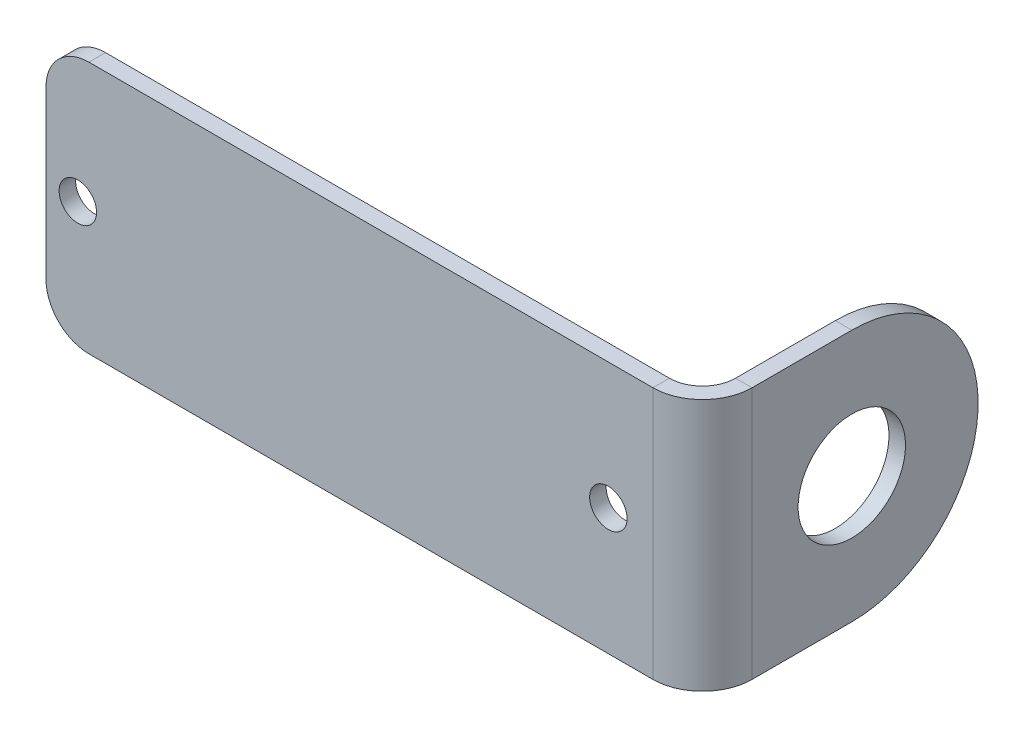
ISO-10303-21;
HEADER;
FILE_DESCRIPTION(('STEP AP214'),'2;1');
FILE_NAME('part.step','',(''),(''),'','','');
FILE_SCHEMA(('AUTOMOTIVE_DESIGN { 1 0 10303 214 1 1 1 1 }'));
ENDSEC;
DATA;
#1=APPLICATION_CONTEXT('core data for automotive mechanical design processes');
#2=APPLICATION_PROTOCOL_DEFINITION('international standard','automotive_design',2000,#1);
#3=PRODUCT_CONTEXT('',#1,'mechanical');
#4=PRODUCT('Part','Part','',(#3));
#5=PRODUCT_RELATED_PRODUCT_CATEGORY('part','',(#4));
#6=PRODUCT_DEFINITION_FORMATION('','',#4);
#7=PRODUCT_DEFINITION_CONTEXT('part definition',#1,'design');
#8=PRODUCT_DEFINITION('design','',#6,#7);
#9=PRODUCT_DEFINITION_SHAPE('','',#8);
#10=(LENGTH_UNIT() NAMED_UNIT(*) SI_UNIT(.MILLI.,.METRE.));
#11=(NAMED_UNIT(*) PLANE_ANGLE_UNIT() SI_UNIT($,.RADIAN.));
#12=(NAMED_UNIT(*) SI_UNIT($,.STERADIAN.) SOLID_ANGLE_UNIT());
#13=UNCERTAINTY_MEASURE_WITH_UNIT(LENGTH_MEASURE(1.E-05),#10,'distance_accuracy_value','');
#14=(GEOMETRIC_REPRESENTATION_CONTEXT(3) GLOBAL_UNCERTAINTY_ASSIGNED_CONTEXT((#13)) GLOBAL_UNIT_ASSIGNED_CONTEXT((#10,
#11,#12)) REPRESENTATION_CONTEXT('',''));
#15=CARTESIAN_POINT('',(0.,0.,0.));
#16=DIRECTION('',(0.,0.,1.));
#17=DIRECTION('',(1.,0.,0.));
#18=AXIS2_PLACEMENT_3D('',#15,#16,#17);
#19=CARTESIAN_POINT('',(31.1197568872597,0.,31.0102431127404));
#20=DIRECTION('',(1.,0.,0.));
#21=DIRECTION('',(0.,0.,-1.));
#22=AXIS2_PLACEMENT_3D('',#19,#20,#21);
#23=PLANE('',#22);
#24=CARTESIAN_POINT('',(31.1197568872595,0.,-12.0547568872596));
#25=DIRECTION('',(1.,0.,0.));
#26=DIRECTION('',(0.,0.,-1.));
#27=AXIS2_PLACEMENT_3D('',#24,#25,#26);
#28=CIRCLE('',#27,4.875);
#29=CARTESIAN_POINT('',(31.1197568872595,0.,-16.9297568872596));
#30=VERTEX_POINT('',#29);
#31=EDGE_CURVE('E191',#30,#30,#28,.T.);
#32=ORIENTED_EDGE('',*,*,#31,.T.);
#33=EDGE_LOOP('',(#32));
#34=FACE_BOUND('',#33,.T.);
#35=DIRECTION('',(0.,0.,-1.));
#36=VECTOR('',#35,1.);
#37=CARTESIAN_POINT('',(31.1197568872597,-11.465,31.0102431127404));
#38=LINE('',#37,#36);
#39=CARTESIAN_POINT('',(31.1197568872595,-11.465,-3.00000000000002));
#40=VERTEX_POINT('',#39);
#41=CARTESIAN_POINT('',(31.1197568872595,-11.465,-12.0547568872596));
#42=VERTEX_POINT('',#41);
#43=EDGE_CURVE('E61',#40,#42,#38,.T.);
#44=ORIENTED_EDGE('',*,*,#43,.F.);
#45=DIRECTION('',(0.,1.,0.));
#46=VECTOR('',#45,1.);
#47=CARTESIAN_POINT('',(31.1197568872595,0.,-3.00000000000002));
#48=LINE('',#47,#46);
#49=CARTESIAN_POINT('',(31.1197568872595,11.465,-3.00000000000002));
#50=VERTEX_POINT('',#49);
#51=EDGE_CURVE('E53',#40,#50,#48,.T.);
#52=ORIENTED_EDGE('',*,*,#51,.T.);
#53=DIRECTION('',(0.,0.,-1.));
#54=VECTOR('',#53,1.);
#55=CARTESIAN_POINT('',(31.1197568872597,11.465,31.0102431127404));
#56=LINE('',#55,#54);
#57=CARTESIAN_POINT('',(31.1197568872595,11.465,-12.0547568872596));
#58=VERTEX_POINT('',#57);
#59=EDGE_CURVE('E69',#58,#50,#56,.F.);
#60=ORIENTED_EDGE('',*,*,#59,.F.);
#61=CARTESIAN_POINT('',(31.1197568872595,0.,-12.0547568872596));
#62=DIRECTION('',(1.,0.,0.));
#63=DIRECTION('',(0.,0.,1.));
#64=AXIS2_PLACEMENT_3D('',#61,#62,#63);
#65=CIRCLE('',#64,11.465);
#66=EDGE_CURVE('E199',#42,#58,#65,.T.);
#67=ORIENTED_EDGE('',*,*,#66,.F.);
#68=EDGE_LOOP('',(#44,#52,#60,#67));
#69=FACE_BOUND('',#68,.T.);
#70=ADVANCED_FACE('F44',(#34,#69),#23,.F.);
#71=CARTESIAN_POINT('',(32.6197568872598,-11.465,57.9752431127404));
#72=DIRECTION('',(0.,-1.,0.));
#73=DIRECTION('',(0.,0.,-1.));
#74=AXIS2_PLACEMENT_3D('',#71,#72,#73);
#75=PLANE('',#74);
#76=DIRECTION('',(1.,0.,0.));
#77=VECTOR('',#76,1.);
#78=CARTESIAN_POINT('',(32.6197568872595,-11.465,-3.00000000000002));
#79=LINE('',#78,#77);
#80=CARTESIAN_POINT('',(32.6197568872595,-11.465,-3.00000000000002));
#81=VERTEX_POINT('',#80);
#82=EDGE_CURVE('E12',#40,#81,#79,.T.);
#83=ORIENTED_EDGE('',*,*,#82,.F.);
#84=ORIENTED_EDGE('',*,*,#43,.T.);
#85=DIRECTION('',(1.,0.,0.));
#86=VECTOR('',#85,1.);
#87=CARTESIAN_POINT('',(31.1197568872595,-11.465,-12.0547568872596));
#88=LINE('',#87,#86);
#89=CARTESIAN_POINT('',(32.6197568872595,-11.465,-12.0547568872596));
#90=VERTEX_POINT('',#89);
#91=EDGE_CURVE('E202',#42,#90,#88,.T.);
#92=ORIENTED_EDGE('',*,*,#91,.T.);
#93=DIRECTION('',(0.,0.,-1.));
#94=VECTOR('',#93,1.);
#95=CARTESIAN_POINT('',(32.6197568872598,-11.465,57.9752431127404));
#96=LINE('',#95,#94);
#97=EDGE_CURVE('E48',#81,#90,#96,.T.);
#98=ORIENTED_EDGE('',*,*,#97,.F.);
#99=EDGE_LOOP('',(#83,#84,#92,#98));
#100=FACE_BOUND('',#99,.T.);
#101=ADVANCED_FACE('F46',(#100),#75,.T.);
#102=CARTESIAN_POINT('',(32.6197568872596,11.465,4.04524311274041));
#103=DIRECTION('',(0.,1.,0.));
#104=DIRECTION('',(0.,0.,1.));
#105=AXIS2_PLACEMENT_3D('',#102,#103,#104);
#106=PLANE('',#105);
#107=DIRECTION('',(-1.,0.,0.));
#108=VECTOR('',#107,1.);
#109=CARTESIAN_POINT('',(32.6197568872595,11.465,-3.00000000000002));
#110=LINE('',#109,#108);
#111=CARTESIAN_POINT('',(32.6197568872595,11.465,-3.00000000000002));
#112=VERTEX_POINT('',#111);
#113=EDGE_CURVE('E211',#112,#50,#110,.T.);
#114=ORIENTED_EDGE('',*,*,#113,.F.);
#115=DIRECTION('',(0.,0.,1.));
#116=VECTOR('',#115,1.);
#117=CARTESIAN_POINT('',(32.6197568872596,11.465,4.04524311274041));
#118=LINE('',#117,#116);
#119=CARTESIAN_POINT('',(32.6197568872595,11.465,-12.0547568872596));
#120=VERTEX_POINT('',#119);
#121=EDGE_CURVE('E215',#120,#112,#118,.T.);
#122=ORIENTED_EDGE('',*,*,#121,.F.);
#123=DIRECTION('',(1.,0.,0.));
#124=VECTOR('',#123,1.);
#125=CARTESIAN_POINT('',(31.1197568872595,11.465,-12.0547568872596));
#126=LINE('',#125,#124);
#127=EDGE_CURVE('E205',#58,#120,#126,.T.);
#128=ORIENTED_EDGE('',*,*,#127,.F.);
#129=ORIENTED_EDGE('',*,*,#59,.T.);
#130=EDGE_LOOP('',(#114,#122,#128,#129));
#131=FACE_BOUND('',#130,.T.);
#132=ADVANCED_FACE('F226',(#131),#106,.T.);
#133=CARTESIAN_POINT('',(32.6197568872597,0.,31.0102431127404));
#134=DIRECTION('',(1.,0.,0.));
#135=DIRECTION('',(0.,0.,-1.));
#136=AXIS2_PLACEMENT_3D('',#133,#134,#135);
#137=PLANE('',#136);
#138=DIRECTION('',(0.,1.,0.));
#139=VECTOR('',#138,1.);
#140=CARTESIAN_POINT('',(32.6197568872595,0.,-3.00000000000002));
#141=LINE('',#140,#139);
#142=EDGE_CURVE('E143',#81,#112,#141,.T.);
#143=ORIENTED_EDGE('',*,*,#142,.F.);
#144=ORIENTED_EDGE('',*,*,#97,.T.);
#145=CARTESIAN_POINT('',(32.6197568872595,0.,-12.0547568872596));
#146=DIRECTION('',(1.,0.,0.));
#147=DIRECTION('',(0.,0.,1.));
#148=AXIS2_PLACEMENT_3D('',#145,#146,#147);
#149=CIRCLE('',#148,11.465);
#150=EDGE_CURVE('E194',#90,#120,#149,.T.);
#151=ORIENTED_EDGE('',*,*,#150,.T.);
#152=ORIENTED_EDGE('',*,*,#121,.T.);
#153=EDGE_LOOP('',(#143,#144,#151,#152));
#154=FACE_BOUND('',#153,.T.);
#155=CARTESIAN_POINT('',(32.6197568872595,0.,-12.0547568872596));
#156=DIRECTION('',(1.,0.,0.));
#157=DIRECTION('',(0.,0.,-1.));
#158=AXIS2_PLACEMENT_3D('',#155,#156,#157);
#159=CIRCLE('',#158,4.875);
#160=CARTESIAN_POINT('',(32.6197568872595,0.,-16.9297568872596));
#161=VERTEX_POINT('',#160);
#162=EDGE_CURVE('E195',#161,#161,#159,.T.);
#163=ORIENTED_EDGE('',*,*,#162,.F.);
#164=EDGE_LOOP('',(#163));
#165=FACE_BOUND('',#164,.T.);
#166=ADVANCED_FACE('F219',(#154,#165),#137,.T.);
#167=CARTESIAN_POINT('',(31.1197568872595,0.,-12.0547568872596));
#168=DIRECTION('',(1.,0.,0.));
#169=DIRECTION('',(0.,0.,-1.));
#170=AXIS2_PLACEMENT_3D('',#167,#168,#169);
#171=CYLINDRICAL_SURFACE('',#170,11.465);
#172=ORIENTED_EDGE('',*,*,#150,.F.);
#173=ORIENTED_EDGE('',*,*,#91,.F.);
#174=ORIENTED_EDGE('',*,*,#66,.T.);
#175=ORIENTED_EDGE('',*,*,#127,.T.);
#176=EDGE_LOOP('',(#172,#173,#174,#175));
#177=FACE_BOUND('',#176,.T.);
#178=ADVANCED_FACE('F225',(#177),#171,.T.);
#179=CARTESIAN_POINT('',(31.1197568872595,0.,-12.0547568872596));
#180=DIRECTION('',(1.,0.,0.));
#181=DIRECTION('',(0.,0.,-1.));
#182=AXIS2_PLACEMENT_3D('',#179,#180,#181);
#183=CYLINDRICAL_SURFACE('',#182,4.875);
#184=ORIENTED_EDGE('',*,*,#31,.F.);
#185=EDGE_LOOP('',(#184));
#186=FACE_BOUND('',#185,.T.);
#187=ORIENTED_EDGE('',*,*,#162,.T.);
#188=EDGE_LOOP('',(#187));
#189=FACE_BOUND('',#188,.T.);
#190=ADVANCED_FACE('F277',(#186,#189),#183,.F.);
#191=CARTESIAN_POINT('',(-23.065,-7.56500000000002,1.49999999999999));
#192=DIRECTION('',(0.,0.,1.));
#193=DIRECTION('',(1.,0.,0.));
#194=AXIS2_PLACEMENT_3D('',#191,#192,#193);
#195=CYLINDRICAL_SURFACE('',#194,3.9);
#196=DIRECTION('',(0.,0.,1.));
#197=VECTOR('',#196,1.);
#198=CARTESIAN_POINT('',(-26.965,-7.56500000000002,1.49999999999999));
#199=LINE('',#198,#197);
#200=CARTESIAN_POINT('',(-26.965,-7.56500000000002,0.));
#201=VERTEX_POINT('',#200);
#202=CARTESIAN_POINT('',(-26.965,-7.56500000000002,1.49999999999999));
#203=VERTEX_POINT('',#202);
#204=EDGE_CURVE('E180',#201,#203,#199,.T.);
#205=ORIENTED_EDGE('',*,*,#204,.F.);
#206=CARTESIAN_POINT('',(-23.065,-7.56500000000002,0.));
#207=DIRECTION('',(0.,0.,1.));
#208=DIRECTION('',(1.,0.,0.));
#209=AXIS2_PLACEMENT_3D('',#206,#207,#208);
#210=CIRCLE('',#209,3.9);
#211=CARTESIAN_POINT('',(-23.065,-11.465,0.));
#212=VERTEX_POINT('',#211);
#213=EDGE_CURVE('E187',#201,#212,#210,.T.);
#214=ORIENTED_EDGE('',*,*,#213,.T.);
#215=DIRECTION('',(0.,0.,1.));
#216=VECTOR('',#215,1.);
#217=CARTESIAN_POINT('',(-23.065,-11.465,1.49999999999999));
#218=LINE('',#217,#216);
#219=CARTESIAN_POINT('',(-23.065,-11.465,1.49999999999999));
#220=VERTEX_POINT('',#219);
#221=EDGE_CURVE('E185',#212,#220,#218,.T.);
#222=ORIENTED_EDGE('',*,*,#221,.T.);
#223=CARTESIAN_POINT('',(-23.065,-7.56500000000002,1.49999999999999));
#224=DIRECTION('',(0.,0.,1.));
#225=DIRECTION('',(1.,0.,0.));
#226=AXIS2_PLACEMENT_3D('',#223,#224,#225);
#227=CIRCLE('',#226,3.9);
#228=EDGE_CURVE('E134',#203,#220,#227,.T.);
#229=ORIENTED_EDGE('',*,*,#228,.F.);
#230=EDGE_LOOP('',(#205,#214,#222,#229));
#231=FACE_BOUND('',#230,.T.);
#232=ADVANCED_FACE('F256',(#231),#195,.T.);
#233=CARTESIAN_POINT('',(-26.965,11.465,1.49999999999999));
#234=DIRECTION('',(-1.,0.,0.));
#235=DIRECTION('',(0.,-1.,0.));
#236=AXIS2_PLACEMENT_3D('',#233,#234,#235);
#237=PLANE('',#236);
#238=DIRECTION('',(0.,0.,1.));
#239=VECTOR('',#238,1.);
#240=CARTESIAN_POINT('',(-26.965,7.56500000000002,1.49999999999999));
#241=LINE('',#240,#239);
#242=CARTESIAN_POINT('',(-26.965,7.56500000000002,0.));
#243=VERTEX_POINT('',#242);
#244=CARTESIAN_POINT('',(-26.965,7.56500000000002,1.49999999999999));
#245=VERTEX_POINT('',#244);
#246=EDGE_CURVE('E175',#243,#245,#241,.T.);
#247=ORIENTED_EDGE('',*,*,#246,.F.);
#248=DIRECTION('',(0.,1.,0.));
#249=VECTOR('',#248,1.);
#250=CARTESIAN_POINT('',(-26.965,0.,0.));
#251=LINE('',#250,#249);
#252=EDGE_CURVE('E182',#243,#201,#251,.F.);
#253=ORIENTED_EDGE('',*,*,#252,.T.);
#254=ORIENTED_EDGE('',*,*,#204,.T.);
#255=DIRECTION('',(0.,-1.,0.));
#256=VECTOR('',#255,1.);
#257=CARTESIAN_POINT('',(-26.965,11.465,1.49999999999999));
#258=LINE('',#257,#256);
#259=EDGE_CURVE('E164',#245,#203,#258,.T.);
#260=ORIENTED_EDGE('',*,*,#259,.F.);
#261=EDGE_LOOP('',(#247,#253,#254,#260));
#262=FACE_BOUND('',#261,.T.);
#263=ADVANCED_FACE('F268',(#262),#237,.T.);
#264=CARTESIAN_POINT('',(-23.065,7.56500000000002,1.49999999999999));
#265=DIRECTION('',(0.,0.,1.));
#266=DIRECTION('',(1.,0.,0.));
#267=AXIS2_PLACEMENT_3D('',#264,#265,#266);
#268=CYLINDRICAL_SURFACE('',#267,3.9);
#269=CARTESIAN_POINT('',(-23.065,7.56500000000002,0.));
#270=DIRECTION('',(0.,0.,1.));
#271=DIRECTION('',(1.,0.,0.));
#272=AXIS2_PLACEMENT_3D('',#269,#270,#271);
#273=CIRCLE('',#272,3.9);
#274=CARTESIAN_POINT('',(-23.065,11.465,0.));
#275=VERTEX_POINT('',#274);
#276=EDGE_CURVE('E177',#275,#243,#273,.T.);
#277=ORIENTED_EDGE('',*,*,#276,.T.);
#278=ORIENTED_EDGE('',*,*,#246,.T.);
#279=CARTESIAN_POINT('',(-23.065,7.56500000000002,1.49999999999999));
#280=DIRECTION('',(0.,0.,1.));
#281=DIRECTION('',(1.,0.,0.));
#282=AXIS2_PLACEMENT_3D('',#279,#280,#281);
#283=CIRCLE('',#282,3.9);
#284=CARTESIAN_POINT('',(-23.065,11.465,1.49999999999999));
#285=VERTEX_POINT('',#284);
#286=EDGE_CURVE('E162',#285,#245,#283,.T.);
#287=ORIENTED_EDGE('',*,*,#286,.F.);
#288=DIRECTION('',(0.,0.,1.));
#289=VECTOR('',#288,1.);
#290=CARTESIAN_POINT('',(-23.065,11.465,1.49999999999999));
#291=LINE('',#290,#289);
#292=EDGE_CURVE('E160',#275,#285,#291,.T.);
#293=ORIENTED_EDGE('',*,*,#292,.F.);
#294=EDGE_LOOP('',(#277,#278,#287,#293));
#295=FACE_BOUND('',#294,.T.);
#296=ADVANCED_FACE('F267',(#295),#268,.T.);
#297=CARTESIAN_POINT('',(-24.0755,0.,1.49999999999999));
#298=DIRECTION('',(0.,0.,1.));
#299=DIRECTION('',(1.,0.,0.));
#300=AXIS2_PLACEMENT_3D('',#297,#298,#299);
#301=CYLINDRICAL_SURFACE('',#300,1.7);
#302=CARTESIAN_POINT('',(-24.0755,0.,1.49999999999999));
#303=DIRECTION('',(0.,0.,1.));
#304=DIRECTION('',(1.,0.,0.));
#305=AXIS2_PLACEMENT_3D('',#302,#303,#304);
#306=CIRCLE('',#305,1.7);
#307=CARTESIAN_POINT('',(-22.3755,0.,1.49999999999999));
#308=VERTEX_POINT('',#307);
#309=EDGE_CURVE('E172',#308,#308,#306,.T.);
#310=ORIENTED_EDGE('',*,*,#309,.T.);
#311=EDGE_LOOP('',(#310));
#312=FACE_BOUND('',#311,.T.);
#313=CARTESIAN_POINT('',(-24.0755,0.,0.));
#314=DIRECTION('',(0.,0.,1.));
#315=DIRECTION('',(1.,0.,0.));
#316=AXIS2_PLACEMENT_3D('',#313,#314,#315);
#317=CIRCLE('',#316,1.7);
#318=CARTESIAN_POINT('',(-22.3755,0.,0.));
#319=VERTEX_POINT('',#318);
#320=EDGE_CURVE('E246',#319,#319,#317,.T.);
#321=ORIENTED_EDGE('',*,*,#320,.F.);
#322=EDGE_LOOP('',(#321));
#323=FACE_BOUND('',#322,.T.);
#324=ADVANCED_FACE('F275',(#312,#323),#301,.F.);
#325=CARTESIAN_POINT('',(24.0755,0.,1.49999999999999));
#326=DIRECTION('',(0.,0.,1.));
#327=DIRECTION('',(1.,0.,0.));
#328=AXIS2_PLACEMENT_3D('',#325,#326,#327);
#329=CYLINDRICAL_SURFACE('',#328,1.7);
#330=CARTESIAN_POINT('',(24.0755,0.,1.49999999999999));
#331=DIRECTION('',(0.,0.,1.));
#332=DIRECTION('',(1.,0.,0.));
#333=AXIS2_PLACEMENT_3D('',#330,#331,#332);
#334=CIRCLE('',#333,1.7);
#335=CARTESIAN_POINT('',(25.7755,0.,1.49999999999999));
#336=VERTEX_POINT('',#335);
#337=EDGE_CURVE('E169',#336,#336,#334,.T.);
#338=ORIENTED_EDGE('',*,*,#337,.T.);
#339=EDGE_LOOP('',(#338));
#340=FACE_BOUND('',#339,.T.);
#341=CARTESIAN_POINT('',(24.0755,0.,0.));
#342=DIRECTION('',(0.,0.,1.));
#343=DIRECTION('',(1.,0.,0.));
#344=AXIS2_PLACEMENT_3D('',#341,#342,#343);
#345=CIRCLE('',#344,1.7);
#346=CARTESIAN_POINT('',(25.7755,0.,0.));
#347=VERTEX_POINT('',#346);
#348=EDGE_CURVE('E243',#347,#347,#345,.T.);
#349=ORIENTED_EDGE('',*,*,#348,.F.);
#350=EDGE_LOOP('',(#349));
#351=FACE_BOUND('',#350,.T.);
#352=ADVANCED_FACE('F303',(#340,#351),#329,.F.);
#353=CARTESIAN_POINT('',(0.,0.,1.49999999999999));
#354=DIRECTION('',(0.,0.,1.));
#355=DIRECTION('',(1.,0.,0.));
#356=AXIS2_PLACEMENT_3D('',#353,#354,#355);
#357=PLANE('',#356);
#358=ORIENTED_EDGE('',*,*,#337,.F.);
#359=EDGE_LOOP('',(#358));
#360=FACE_BOUND('',#359,.T.);
#361=ORIENTED_EDGE('',*,*,#309,.F.);
#362=EDGE_LOOP('',(#361));
#363=FACE_BOUND('',#362,.T.);
#364=DIRECTION('',(1.,0.,0.));
#365=VECTOR('',#364,1.);
#366=CARTESIAN_POINT('',(-26.965,-11.465,1.49999999999999));
#367=LINE('',#366,#365);
#368=CARTESIAN_POINT('',(28.1197568872595,-11.465,1.49999999999999));
#369=VERTEX_POINT('',#368);
#370=EDGE_CURVE('E155',#220,#369,#367,.T.);
#371=ORIENTED_EDGE('',*,*,#370,.T.);
#372=DIRECTION('',(0.,1.,0.));
#373=VECTOR('',#372,1.);
#374=CARTESIAN_POINT('',(28.1197568872595,0.,1.49999999999999));
#375=LINE('',#374,#373);
#376=CARTESIAN_POINT('',(28.1197568872595,11.465,1.49999999999999));
#377=VERTEX_POINT('',#376);
#378=EDGE_CURVE('E141',#369,#377,#375,.T.);
#379=ORIENTED_EDGE('',*,*,#378,.T.);
#380=DIRECTION('',(-1.,0.,0.));
#381=VECTOR('',#380,1.);
#382=CARTESIAN_POINT('',(26.965,11.465,1.49999999999999));
#383=LINE('',#382,#381);
#384=EDGE_CURVE('E151',#377,#285,#383,.T.);
#385=ORIENTED_EDGE('',*,*,#384,.T.);
#386=ORIENTED_EDGE('',*,*,#286,.T.);
#387=ORIENTED_EDGE('',*,*,#259,.T.);
#388=ORIENTED_EDGE('',*,*,#228,.T.);
#389=EDGE_LOOP('',(#371,#379,#385,#386,#387,#388));
#390=FACE_BOUND('',#389,.T.);
#391=ADVANCED_FACE('F149',(#360,#363,#390),#357,.T.);
#392=CARTESIAN_POINT('',(26.965,11.465,1.49999999999999));
#393=DIRECTION('',(0.,1.,0.));
#394=DIRECTION('',(-1.,0.,0.));
#395=AXIS2_PLACEMENT_3D('',#392,#393,#394);
#396=PLANE('',#395);
#397=ORIENTED_EDGE('',*,*,#384,.F.);
#398=DIRECTION('',(0.,0.,-1.));
#399=VECTOR('',#398,1.);
#400=CARTESIAN_POINT('',(28.1197568872595,11.465,1.49999999999999));
#401=LINE('',#400,#399);
#402=CARTESIAN_POINT('',(28.1197568872595,11.465,0.));
#403=VERTEX_POINT('',#402);
#404=EDGE_CURVE('E123',#377,#403,#401,.T.);
#405=ORIENTED_EDGE('',*,*,#404,.T.);
#406=DIRECTION('',(1.,0.,0.));
#407=VECTOR('',#406,1.);
#408=CARTESIAN_POINT('',(0.,11.465,0.));
#409=LINE('',#408,#407);
#410=EDGE_CURVE('E133',#403,#275,#409,.F.);
#411=ORIENTED_EDGE('',*,*,#410,.T.);
#412=ORIENTED_EDGE('',*,*,#292,.T.);
#413=EDGE_LOOP('',(#397,#405,#411,#412));
#414=FACE_BOUND('',#413,.T.);
#415=ADVANCED_FACE('F158',(#414),#396,.T.);
#416=CARTESIAN_POINT('',(0.,0.,0.));
#417=DIRECTION('',(0.,0.,1.));
#418=DIRECTION('',(1.,0.,0.));
#419=AXIS2_PLACEMENT_3D('',#416,#417,#418);
#420=PLANE('',#419);
#421=DIRECTION('',(0.,1.,0.));
#422=VECTOR('',#421,1.);
#423=CARTESIAN_POINT('',(28.1197568872595,0.,0.));
#424=LINE('',#423,#422);
#425=CARTESIAN_POINT('',(28.1197568872595,-11.465,0.));
#426=VERTEX_POINT('',#425);
#427=EDGE_CURVE('E144',#426,#403,#424,.T.);
#428=ORIENTED_EDGE('',*,*,#427,.F.);
#429=DIRECTION('',(1.,0.,0.));
#430=VECTOR('',#429,1.);
#431=CARTESIAN_POINT('',(0.,-11.465,0.));
#432=LINE('',#431,#430);
#433=EDGE_CURVE('E240',#212,#426,#432,.T.);
#434=ORIENTED_EDGE('',*,*,#433,.F.);
#435=ORIENTED_EDGE('',*,*,#213,.F.);
#436=ORIENTED_EDGE('',*,*,#252,.F.);
#437=ORIENTED_EDGE('',*,*,#276,.F.);
#438=ORIENTED_EDGE('',*,*,#410,.F.);
#439=EDGE_LOOP('',(#428,#434,#435,#436,#437,#438));
#440=FACE_BOUND('',#439,.T.);
#441=ORIENTED_EDGE('',*,*,#320,.T.);
#442=EDGE_LOOP('',(#441));
#443=FACE_BOUND('',#442,.T.);
#444=ORIENTED_EDGE('',*,*,#348,.T.);
#445=EDGE_LOOP('',(#444));
#446=FACE_BOUND('',#445,.T.);
#447=ADVANCED_FACE('F262',(#440,#443,#446),#420,.F.);
#448=CARTESIAN_POINT('',(-26.965,-11.465,1.49999999999999));
#449=DIRECTION('',(0.,-1.,0.));
#450=DIRECTION('',(1.,0.,0.));
#451=AXIS2_PLACEMENT_3D('',#448,#449,#450);
#452=PLANE('',#451);
#453=ORIENTED_EDGE('',*,*,#433,.T.);
#454=DIRECTION('',(0.,0.,1.));
#455=VECTOR('',#454,1.);
#456=CARTESIAN_POINT('',(28.1197568872595,-11.465,1.49999999999999));
#457=LINE('',#456,#455);
#458=EDGE_CURVE('E198',#426,#369,#457,.T.);
#459=ORIENTED_EDGE('',*,*,#458,.T.);
#460=ORIENTED_EDGE('',*,*,#370,.F.);
#461=ORIENTED_EDGE('',*,*,#221,.F.);
#462=EDGE_LOOP('',(#453,#459,#460,#461));
#463=FACE_BOUND('',#462,.T.);
#464=ADVANCED_FACE('F260',(#463),#452,.T.);
#465=CARTESIAN_POINT('',(28.1197568872595,-11.465,-3.00000000000001));
#466=DIRECTION('',(0.,-1.,0.));
#467=DIRECTION('',(0.,0.,-1.));
#468=AXIS2_PLACEMENT_3D('',#465,#466,#467);
#469=PLANE('',#468);
#470=ORIENTED_EDGE('',*,*,#458,.F.);
#471=CARTESIAN_POINT('',(28.1197568872595,-11.465,-3.00000000000001));
#472=DIRECTION('',(0.,1.,0.));
#473=DIRECTION('',(-1.,0.,0.));
#474=AXIS2_PLACEMENT_3D('',#471,#472,#473);
#475=CIRCLE('',#474,3.);
#476=EDGE_CURVE('E234',#426,#40,#475,.T.);
#477=ORIENTED_EDGE('',*,*,#476,.T.);
#478=ORIENTED_EDGE('',*,*,#82,.T.);
#479=CARTESIAN_POINT('',(28.1197568872595,-11.465,-3.00000000000001));
#480=DIRECTION('',(0.,1.,0.));
#481=DIRECTION('',(0.,0.,1.));
#482=AXIS2_PLACEMENT_3D('',#479,#480,#481);
#483=CIRCLE('',#482,4.5);
#484=EDGE_CURVE('E145',#369,#81,#483,.T.);
#485=ORIENTED_EDGE('',*,*,#484,.F.);
#486=EDGE_LOOP('',(#470,#477,#478,#485));
#487=FACE_BOUND('',#486,.T.);
#488=ADVANCED_FACE('F296',(#487),#469,.T.);
#489=CARTESIAN_POINT('',(28.1197568872595,11.465,-3.00000000000001));
#490=DIRECTION('',(0.,1.,0.));
#491=DIRECTION('',(0.,0.,1.));
#492=AXIS2_PLACEMENT_3D('',#489,#490,#491);
#493=PLANE('',#492);
#494=CARTESIAN_POINT('',(28.1197568872595,11.465,-3.00000000000001));
#495=DIRECTION('',(0.,1.,0.));
#496=DIRECTION('',(-1.,0.,0.));
#497=AXIS2_PLACEMENT_3D('',#494,#495,#496);
#498=CIRCLE('',#497,3.);
#499=EDGE_CURVE('E129',#50,#403,#498,.F.);
#500=ORIENTED_EDGE('',*,*,#499,.T.);
#501=ORIENTED_EDGE('',*,*,#404,.F.);
#502=CARTESIAN_POINT('',(28.1197568872595,11.465,-3.00000000000001));
#503=DIRECTION('',(0.,-1.,0.));
#504=DIRECTION('',(0.,0.,-1.));
#505=AXIS2_PLACEMENT_3D('',#502,#503,#504);
#506=CIRCLE('',#505,4.5);
#507=EDGE_CURVE('E127',#112,#377,#506,.T.);
#508=ORIENTED_EDGE('',*,*,#507,.F.);
#509=ORIENTED_EDGE('',*,*,#113,.T.);
#510=EDGE_LOOP('',(#500,#501,#508,#509));
#511=FACE_BOUND('',#510,.T.);
#512=ADVANCED_FACE('F125',(#511),#493,.T.);
#513=CARTESIAN_POINT('',(28.1197568872595,-23.7219882803399,-3.00000000000001));
#514=DIRECTION('',(0.,1.,0.));
#515=DIRECTION('',(-1.,0.,0.));
#516=AXIS2_PLACEMENT_3D('',#513,#514,#515);
#517=CYLINDRICAL_SURFACE('',#516,4.5);
#518=ORIENTED_EDGE('',*,*,#142,.T.);
#519=ORIENTED_EDGE('',*,*,#507,.T.);
#520=ORIENTED_EDGE('',*,*,#378,.F.);
#521=ORIENTED_EDGE('',*,*,#484,.T.);
#522=EDGE_LOOP('',(#518,#519,#520,#521));
#523=FACE_BOUND('',#522,.T.);
#524=ADVANCED_FACE('F139',(#523),#517,.T.);
#525=CARTESIAN_POINT('',(28.1197568872595,-23.7219882803399,-3.00000000000001));
#526=DIRECTION('',(0.,1.,0.));
#527=DIRECTION('',(-1.,0.,0.));
#528=AXIS2_PLACEMENT_3D('',#525,#526,#527);
#529=CYLINDRICAL_SURFACE('',#528,3.);
#530=ORIENTED_EDGE('',*,*,#51,.F.);
#531=ORIENTED_EDGE('',*,*,#476,.F.);
#532=ORIENTED_EDGE('',*,*,#427,.T.);
#533=ORIENTED_EDGE('',*,*,#499,.F.);
#534=EDGE_LOOP('',(#530,#531,#532,#533));
#535=FACE_BOUND('',#534,.T.);
#536=ADVANCED_FACE('F229',(#535),#529,.F.);
#537=CLOSED_SHELL('',(#70,#101,#132,#166,#178,#190,#232,#263,#296,#324,#352,#391,#415,#447,#464,
#488,#512,#524,#536));
#538=MANIFOLD_SOLID_BREP('B2',#537);
#539=ADVANCED_BREP_SHAPE_REPRESENTATION('',(#18,#538),#14);
#540=SHAPE_DEFINITION_REPRESENTATION(#9,#539);
ENDSEC;
END-ISO-10303-21;
